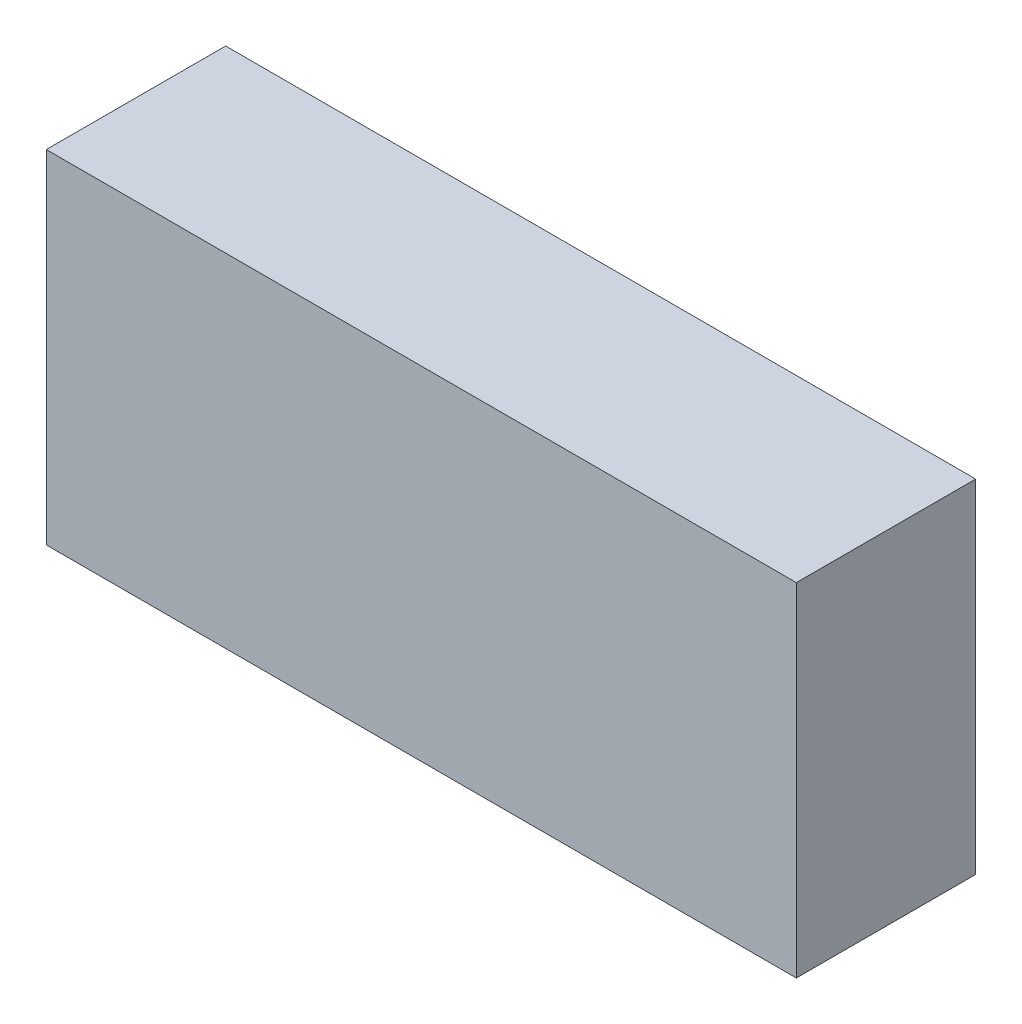
ISO-10303-21;
HEADER;
FILE_DESCRIPTION(('STEP AP214'),'2;1');
FILE_NAME('part.step','',(''),(''),'','','');
FILE_SCHEMA(('AUTOMOTIVE_DESIGN { 1 0 10303 214 1 1 1 1 }'));
ENDSEC;
DATA;
#1=APPLICATION_CONTEXT('core data for automotive mechanical design processes');
#2=APPLICATION_PROTOCOL_DEFINITION('international standard','automotive_design',2000,#1);
#3=PRODUCT_CONTEXT('',#1,'mechanical');
#4=PRODUCT('Part','Part','',(#3));
#5=PRODUCT_RELATED_PRODUCT_CATEGORY('part','',(#4));
#6=PRODUCT_DEFINITION_FORMATION('','',#4);
#7=PRODUCT_DEFINITION_CONTEXT('part definition',#1,'design');
#8=PRODUCT_DEFINITION('design','',#6,#7);
#9=PRODUCT_DEFINITION_SHAPE('','',#8);
#10=(LENGTH_UNIT() NAMED_UNIT(*) SI_UNIT(.MILLI.,.METRE.));
#11=(NAMED_UNIT(*) PLANE_ANGLE_UNIT() SI_UNIT($,.RADIAN.));
#12=(NAMED_UNIT(*) SI_UNIT($,.STERADIAN.) SOLID_ANGLE_UNIT());
#13=UNCERTAINTY_MEASURE_WITH_UNIT(LENGTH_MEASURE(1.E-05),#10,'distance_accuracy_value','');
#14=(GEOMETRIC_REPRESENTATION_CONTEXT(3) GLOBAL_UNCERTAINTY_ASSIGNED_CONTEXT((#13)) GLOBAL_UNIT_ASSIGNED_CONTEXT((#10,
#11,#12)) REPRESENTATION_CONTEXT('',''));
#15=CARTESIAN_POINT('',(0.,0.,0.));
#16=DIRECTION('',(0.,0.,1.));
#17=DIRECTION('',(1.,0.,0.));
#18=AXIS2_PLACEMENT_3D('',#15,#16,#17);
#19=CARTESIAN_POINT('',(-118.,-10.5,62.5));
#20=DIRECTION('',(0.,0.,1.));
#21=DIRECTION('',(1.,0.,0.));
#22=AXIS2_PLACEMENT_3D('',#19,#20,#21);
#23=PLANE('',#22);
#24=DIRECTION('',(0.,1.,0.));
#25=VECTOR('',#24,1.);
#26=CARTESIAN_POINT('',(-118.,-10.5,62.5));
#27=LINE('',#26,#25);
#28=CARTESIAN_POINT('',(-118.,-10.5,62.5));
#29=VERTEX_POINT('',#28);
#30=CARTESIAN_POINT('',(-118.,10.5,62.5));
#31=VERTEX_POINT('',#30);
#32=EDGE_CURVE('E87',#29,#31,#27,.T.);
#33=ORIENTED_EDGE('',*,*,#32,.F.);
#34=DIRECTION('',(1.,0.,0.));
#35=VECTOR('',#34,1.);
#36=CARTESIAN_POINT('',(-118.,-10.5,62.5));
#37=LINE('',#36,#35);
#38=CARTESIAN_POINT('',(-72.,-10.5,62.5));
#39=VERTEX_POINT('',#38);
#40=EDGE_CURVE('E96',#29,#39,#37,.T.);
#41=ORIENTED_EDGE('',*,*,#40,.T.);
#42=DIRECTION('',(0.,1.,0.));
#43=VECTOR('',#42,1.);
#44=CARTESIAN_POINT('',(-72.,-10.5,62.5));
#45=LINE('',#44,#43);
#46=CARTESIAN_POINT('',(-72.,10.5,62.5));
#47=VERTEX_POINT('',#46);
#48=EDGE_CURVE('E101',#39,#47,#45,.T.);
#49=ORIENTED_EDGE('',*,*,#48,.T.);
#50=DIRECTION('',(1.,0.,0.));
#51=VECTOR('',#50,1.);
#52=CARTESIAN_POINT('',(-118.,10.5,62.5));
#53=LINE('',#52,#51);
#54=EDGE_CURVE('E10',#31,#47,#53,.T.);
#55=ORIENTED_EDGE('',*,*,#54,.F.);
#56=EDGE_LOOP('',(#33,#41,#49,#55));
#57=FACE_BOUND('',#56,.T.);
#58=ADVANCED_FACE('F15',(#57),#23,.T.);
#59=CARTESIAN_POINT('',(-118.,-10.5,51.5));
#60=DIRECTION('',(0.,0.,1.));
#61=DIRECTION('',(1.,0.,0.));
#62=AXIS2_PLACEMENT_3D('',#59,#60,#61);
#63=PLANE('',#62);
#64=DIRECTION('',(1.,0.,0.));
#65=VECTOR('',#64,1.);
#66=CARTESIAN_POINT('',(-118.,10.5,51.5));
#67=LINE('',#66,#65);
#68=CARTESIAN_POINT('',(-118.,10.5,51.5));
#69=VERTEX_POINT('',#68);
#70=CARTESIAN_POINT('',(-72.,10.5,51.5));
#71=VERTEX_POINT('',#70);
#72=EDGE_CURVE('E26',#69,#71,#67,.T.);
#73=ORIENTED_EDGE('',*,*,#72,.T.);
#74=DIRECTION('',(0.,1.,0.));
#75=VECTOR('',#74,1.);
#76=CARTESIAN_POINT('',(-72.,-10.5,51.5));
#77=LINE('',#76,#75);
#78=CARTESIAN_POINT('',(-72.,-10.5,51.5));
#79=VERTEX_POINT('',#78);
#80=EDGE_CURVE('E98',#79,#71,#77,.T.);
#81=ORIENTED_EDGE('',*,*,#80,.F.);
#82=DIRECTION('',(1.,0.,0.));
#83=VECTOR('',#82,1.);
#84=CARTESIAN_POINT('',(-118.,-10.5,51.5));
#85=LINE('',#84,#83);
#86=CARTESIAN_POINT('',(-118.,-10.5,51.5));
#87=VERTEX_POINT('',#86);
#88=EDGE_CURVE('E64',#87,#79,#85,.T.);
#89=ORIENTED_EDGE('',*,*,#88,.F.);
#90=DIRECTION('',(0.,1.,0.));
#91=VECTOR('',#90,1.);
#92=CARTESIAN_POINT('',(-118.,-10.5,51.5));
#93=LINE('',#92,#91);
#94=EDGE_CURVE('E79',#87,#69,#93,.T.);
#95=ORIENTED_EDGE('',*,*,#94,.T.);
#96=EDGE_LOOP('',(#73,#81,#89,#95));
#97=FACE_BOUND('',#96,.T.);
#98=ADVANCED_FACE('F80',(#97),#63,.F.);
#99=CARTESIAN_POINT('',(-118.,10.5,51.5));
#100=DIRECTION('',(0.,1.,0.));
#101=DIRECTION('',(1.,0.,0.));
#102=AXIS2_PLACEMENT_3D('',#99,#100,#101);
#103=PLANE('',#102);
#104=ORIENTED_EDGE('',*,*,#72,.F.);
#105=DIRECTION('',(0.,0.,1.));
#106=VECTOR('',#105,1.);
#107=CARTESIAN_POINT('',(-118.,10.5,51.5));
#108=LINE('',#107,#106);
#109=EDGE_CURVE('E71',#69,#31,#108,.T.);
#110=ORIENTED_EDGE('',*,*,#109,.T.);
#111=ORIENTED_EDGE('',*,*,#54,.T.);
#112=DIRECTION('',(0.,0.,1.));
#113=VECTOR('',#112,1.);
#114=CARTESIAN_POINT('',(-72.,10.5,51.5));
#115=LINE('',#114,#113);
#116=EDGE_CURVE('E74',#71,#47,#115,.T.);
#117=ORIENTED_EDGE('',*,*,#116,.F.);
#118=EDGE_LOOP('',(#104,#110,#111,#117));
#119=FACE_BOUND('',#118,.T.);
#120=ADVANCED_FACE('F69',(#119),#103,.T.);
#121=CARTESIAN_POINT('',(-118.,-10.5,51.5));
#122=DIRECTION('',(0.,1.,0.));
#123=DIRECTION('',(1.,0.,0.));
#124=AXIS2_PLACEMENT_3D('',#121,#122,#123);
#125=PLANE('',#124);
#126=DIRECTION('',(0.,0.,1.));
#127=VECTOR('',#126,1.);
#128=CARTESIAN_POINT('',(-72.,-10.5,51.5));
#129=LINE('',#128,#127);
#130=EDGE_CURVE('E19',#79,#39,#129,.T.);
#131=ORIENTED_EDGE('',*,*,#130,.T.);
#132=ORIENTED_EDGE('',*,*,#40,.F.);
#133=DIRECTION('',(0.,0.,1.));
#134=VECTOR('',#133,1.);
#135=CARTESIAN_POINT('',(-118.,-10.5,51.5));
#136=LINE('',#135,#134);
#137=EDGE_CURVE('E84',#87,#29,#136,.T.);
#138=ORIENTED_EDGE('',*,*,#137,.F.);
#139=ORIENTED_EDGE('',*,*,#88,.T.);
#140=EDGE_LOOP('',(#131,#132,#138,#139));
#141=FACE_BOUND('',#140,.T.);
#142=ADVANCED_FACE('F114',(#141),#125,.F.);
#143=CARTESIAN_POINT('',(-72.,-10.5,51.5));
#144=DIRECTION('',(1.,0.,0.));
#145=DIRECTION('',(0.,1.,0.));
#146=AXIS2_PLACEMENT_3D('',#143,#144,#145);
#147=PLANE('',#146);
#148=ORIENTED_EDGE('',*,*,#130,.F.);
#149=ORIENTED_EDGE('',*,*,#80,.T.);
#150=ORIENTED_EDGE('',*,*,#116,.T.);
#151=ORIENTED_EDGE('',*,*,#48,.F.);
#152=EDGE_LOOP('',(#148,#149,#150,#151));
#153=FACE_BOUND('',#152,.T.);
#154=ADVANCED_FACE('F113',(#153),#147,.T.);
#155=CARTESIAN_POINT('',(-118.,-10.5,51.5));
#156=DIRECTION('',(1.,0.,0.));
#157=DIRECTION('',(0.,1.,0.));
#158=AXIS2_PLACEMENT_3D('',#155,#156,#157);
#159=PLANE('',#158);
#160=ORIENTED_EDGE('',*,*,#32,.T.);
#161=ORIENTED_EDGE('',*,*,#109,.F.);
#162=ORIENTED_EDGE('',*,*,#94,.F.);
#163=ORIENTED_EDGE('',*,*,#137,.T.);
#164=EDGE_LOOP('',(#160,#161,#162,#163));
#165=FACE_BOUND('',#164,.T.);
#166=ADVANCED_FACE('F17',(#165),#159,.F.);
#167=CLOSED_SHELL('',(#58,#98,#120,#142,#154,#166));
#168=MANIFOLD_SOLID_BREP('B1',#167);
#169=ADVANCED_BREP_SHAPE_REPRESENTATION('',(#18,#168),#14);
#170=SHAPE_DEFINITION_REPRESENTATION(#9,#169);
ENDSEC;
END-ISO-10303-21;
